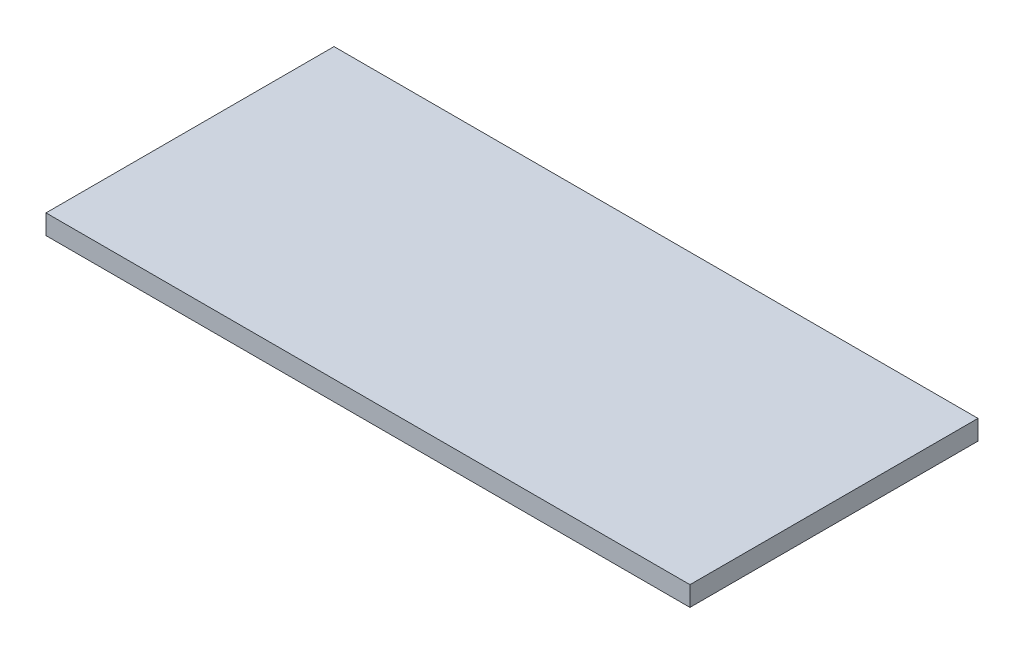
ISO-10303-21;
HEADER;
FILE_DESCRIPTION(('STEP AP214'),'2;1');
FILE_NAME('part.step','',(''),(''),'','','');
FILE_SCHEMA(('AUTOMOTIVE_DESIGN { 1 0 10303 214 1 1 1 1 }'));
ENDSEC;
DATA;
#1=APPLICATION_CONTEXT('core data for automotive mechanical design processes');
#2=APPLICATION_PROTOCOL_DEFINITION('international standard','automotive_design',2000,#1);
#3=PRODUCT_CONTEXT('',#1,'mechanical');
#4=PRODUCT('Part','Part','',(#3));
#5=PRODUCT_RELATED_PRODUCT_CATEGORY('part','',(#4));
#6=PRODUCT_DEFINITION_FORMATION('','',#4);
#7=PRODUCT_DEFINITION_CONTEXT('part definition',#1,'design');
#8=PRODUCT_DEFINITION('design','',#6,#7);
#9=PRODUCT_DEFINITION_SHAPE('','',#8);
#10=(LENGTH_UNIT() NAMED_UNIT(*) SI_UNIT(.MILLI.,.METRE.));
#11=(NAMED_UNIT(*) PLANE_ANGLE_UNIT() SI_UNIT($,.RADIAN.));
#12=(NAMED_UNIT(*) SI_UNIT($,.STERADIAN.) SOLID_ANGLE_UNIT());
#13=UNCERTAINTY_MEASURE_WITH_UNIT(LENGTH_MEASURE(1.E-05),#10,'distance_accuracy_value','');
#14=(GEOMETRIC_REPRESENTATION_CONTEXT(3) GLOBAL_UNCERTAINTY_ASSIGNED_CONTEXT((#13)) GLOBAL_UNIT_ASSIGNED_CONTEXT((#10,
#11,#12)) REPRESENTATION_CONTEXT('',''));
#15=CARTESIAN_POINT('',(0.,0.,0.));
#16=DIRECTION('',(0.,0.,1.));
#17=DIRECTION('',(1.,0.,0.));
#18=AXIS2_PLACEMENT_3D('',#15,#16,#17);
#19=CARTESIAN_POINT('',(0.,18.,0.));
#20=DIRECTION('',(1.,0.,0.));
#21=DIRECTION('',(0.,0.,-1.));
#22=AXIS2_PLACEMENT_3D('',#19,#20,#21);
#23=PLANE('',#22);
#24=DIRECTION('',(0.,0.,1.));
#25=VECTOR('',#24,1.);
#26=CARTESIAN_POINT('',(0.,0.,0.));
#27=LINE('',#26,#25);
#28=CARTESIAN_POINT('',(0.,0.,-263.));
#29=VERTEX_POINT('',#28);
#30=CARTESIAN_POINT('',(0.,0.,0.));
#31=VERTEX_POINT('',#30);
#32=EDGE_CURVE('E97',#29,#31,#27,.T.);
#33=ORIENTED_EDGE('',*,*,#32,.T.);
#34=DIRECTION('',(0.,-1.,0.));
#35=VECTOR('',#34,1.);
#36=CARTESIAN_POINT('',(0.,18.,0.));
#37=LINE('',#36,#35);
#38=CARTESIAN_POINT('',(0.,18.,0.));
#39=VERTEX_POINT('',#38);
#40=EDGE_CURVE('E11',#39,#31,#37,.T.);
#41=ORIENTED_EDGE('',*,*,#40,.F.);
#42=DIRECTION('',(0.,0.,1.));
#43=VECTOR('',#42,1.);
#44=CARTESIAN_POINT('',(0.,18.,0.));
#45=LINE('',#44,#43);
#46=CARTESIAN_POINT('',(0.,18.,-263.));
#47=VERTEX_POINT('',#46);
#48=EDGE_CURVE('E85',#47,#39,#45,.T.);
#49=ORIENTED_EDGE('',*,*,#48,.F.);
#50=DIRECTION('',(0.,-1.,0.));
#51=VECTOR('',#50,1.);
#52=CARTESIAN_POINT('',(0.,18.,-263.));
#53=LINE('',#52,#51);
#54=EDGE_CURVE('E93',#47,#29,#53,.T.);
#55=ORIENTED_EDGE('',*,*,#54,.T.);
#56=EDGE_LOOP('',(#33,#41,#49,#55));
#57=FACE_BOUND('',#56,.T.);
#58=ADVANCED_FACE('F34',(#57),#23,.F.);
#59=CARTESIAN_POINT('',(0.,18.,0.));
#60=DIRECTION('',(0.,0.,-1.));
#61=DIRECTION('',(-1.,0.,0.));
#62=AXIS2_PLACEMENT_3D('',#59,#60,#61);
#63=PLANE('',#62);
#64=DIRECTION('',(1.,0.,0.));
#65=VECTOR('',#64,1.);
#66=CARTESIAN_POINT('',(0.,0.,0.));
#67=LINE('',#66,#65);
#68=CARTESIAN_POINT('',(588.,0.,0.));
#69=VERTEX_POINT('',#68);
#70=EDGE_CURVE('E89',#31,#69,#67,.T.);
#71=ORIENTED_EDGE('',*,*,#70,.T.);
#72=DIRECTION('',(0.,-1.,0.));
#73=VECTOR('',#72,1.);
#74=CARTESIAN_POINT('',(588.,18.,0.));
#75=LINE('',#74,#73);
#76=CARTESIAN_POINT('',(588.,18.,0.));
#77=VERTEX_POINT('',#76);
#78=EDGE_CURVE('E42',#77,#69,#75,.T.);
#79=ORIENTED_EDGE('',*,*,#78,.F.);
#80=DIRECTION('',(1.,0.,0.));
#81=VECTOR('',#80,1.);
#82=CARTESIAN_POINT('',(0.,18.,0.));
#83=LINE('',#82,#81);
#84=EDGE_CURVE('E80',#39,#77,#83,.T.);
#85=ORIENTED_EDGE('',*,*,#84,.F.);
#86=ORIENTED_EDGE('',*,*,#40,.T.);
#87=EDGE_LOOP('',(#71,#79,#85,#86));
#88=FACE_BOUND('',#87,.T.);
#89=ADVANCED_FACE('F88',(#88),#63,.F.);
#90=CARTESIAN_POINT('',(588.,18.,0.));
#91=DIRECTION('',(-1.,0.,0.));
#92=DIRECTION('',(0.,0.,1.));
#93=AXIS2_PLACEMENT_3D('',#90,#91,#92);
#94=PLANE('',#93);
#95=DIRECTION('',(0.,0.,-1.));
#96=VECTOR('',#95,1.);
#97=CARTESIAN_POINT('',(588.,0.,0.));
#98=LINE('',#97,#96);
#99=CARTESIAN_POINT('',(588.,0.,-263.));
#100=VERTEX_POINT('',#99);
#101=EDGE_CURVE('E67',#69,#100,#98,.T.);
#102=ORIENTED_EDGE('',*,*,#101,.T.);
#103=DIRECTION('',(0.,-1.,0.));
#104=VECTOR('',#103,1.);
#105=CARTESIAN_POINT('',(588.,18.,-263.));
#106=LINE('',#105,#104);
#107=CARTESIAN_POINT('',(588.,18.,-263.));
#108=VERTEX_POINT('',#107);
#109=EDGE_CURVE('E90',#108,#100,#106,.T.);
#110=ORIENTED_EDGE('',*,*,#109,.F.);
#111=DIRECTION('',(0.,0.,-1.));
#112=VECTOR('',#111,1.);
#113=CARTESIAN_POINT('',(588.,18.,0.));
#114=LINE('',#113,#112);
#115=EDGE_CURVE('E83',#77,#108,#114,.T.);
#116=ORIENTED_EDGE('',*,*,#115,.F.);
#117=ORIENTED_EDGE('',*,*,#78,.T.);
#118=EDGE_LOOP('',(#102,#110,#116,#117));
#119=FACE_BOUND('',#118,.T.);
#120=ADVANCED_FACE('F91',(#119),#94,.F.);
#121=CARTESIAN_POINT('',(0.,18.,-263.));
#122=DIRECTION('',(0.,0.,1.));
#123=DIRECTION('',(1.,0.,0.));
#124=AXIS2_PLACEMENT_3D('',#121,#122,#123);
#125=PLANE('',#124);
#126=DIRECTION('',(-1.,0.,0.));
#127=VECTOR('',#126,1.);
#128=CARTESIAN_POINT('',(0.,0.,-263.));
#129=LINE('',#128,#127);
#130=EDGE_CURVE('E73',#100,#29,#129,.T.);
#131=ORIENTED_EDGE('',*,*,#130,.T.);
#132=ORIENTED_EDGE('',*,*,#54,.F.);
#133=DIRECTION('',(-1.,0.,0.));
#134=VECTOR('',#133,1.);
#135=CARTESIAN_POINT('',(0.,18.,-263.));
#136=LINE('',#135,#134);
#137=EDGE_CURVE('E50',#108,#47,#136,.T.);
#138=ORIENTED_EDGE('',*,*,#137,.F.);
#139=ORIENTED_EDGE('',*,*,#109,.T.);
#140=EDGE_LOOP('',(#131,#132,#138,#139));
#141=FACE_BOUND('',#140,.T.);
#142=ADVANCED_FACE('F104',(#141),#125,.F.);
#143=CARTESIAN_POINT('',(0.,18.,0.));
#144=DIRECTION('',(0.,-1.,0.));
#145=DIRECTION('',(0.,0.,-1.));
#146=AXIS2_PLACEMENT_3D('',#143,#144,#145);
#147=PLANE('',#146);
#148=ORIENTED_EDGE('',*,*,#48,.T.);
#149=ORIENTED_EDGE('',*,*,#84,.T.);
#150=ORIENTED_EDGE('',*,*,#115,.T.);
#151=ORIENTED_EDGE('',*,*,#137,.T.);
#152=EDGE_LOOP('',(#148,#149,#150,#151));
#153=FACE_BOUND('',#152,.T.);
#154=ADVANCED_FACE('F81',(#153),#147,.F.);
#155=CARTESIAN_POINT('',(0.,0.,0.));
#156=DIRECTION('',(0.,-1.,0.));
#157=DIRECTION('',(0.,0.,-1.));
#158=AXIS2_PLACEMENT_3D('',#155,#156,#157);
#159=PLANE('',#158);
#160=ORIENTED_EDGE('',*,*,#32,.F.);
#161=ORIENTED_EDGE('',*,*,#130,.F.);
#162=ORIENTED_EDGE('',*,*,#101,.F.);
#163=ORIENTED_EDGE('',*,*,#70,.F.);
#164=EDGE_LOOP('',(#160,#161,#162,#163));
#165=FACE_BOUND('',#164,.T.);
#166=ADVANCED_FACE('F107',(#165),#159,.T.);
#167=CLOSED_SHELL('',(#58,#89,#120,#142,#154,#166));
#168=MANIFOLD_SOLID_BREP('B2',#167);
#169=ADVANCED_BREP_SHAPE_REPRESENTATION('',(#18,#168),#14);
#170=SHAPE_DEFINITION_REPRESENTATION(#9,#169);
ENDSEC;
END-ISO-10303-21;
